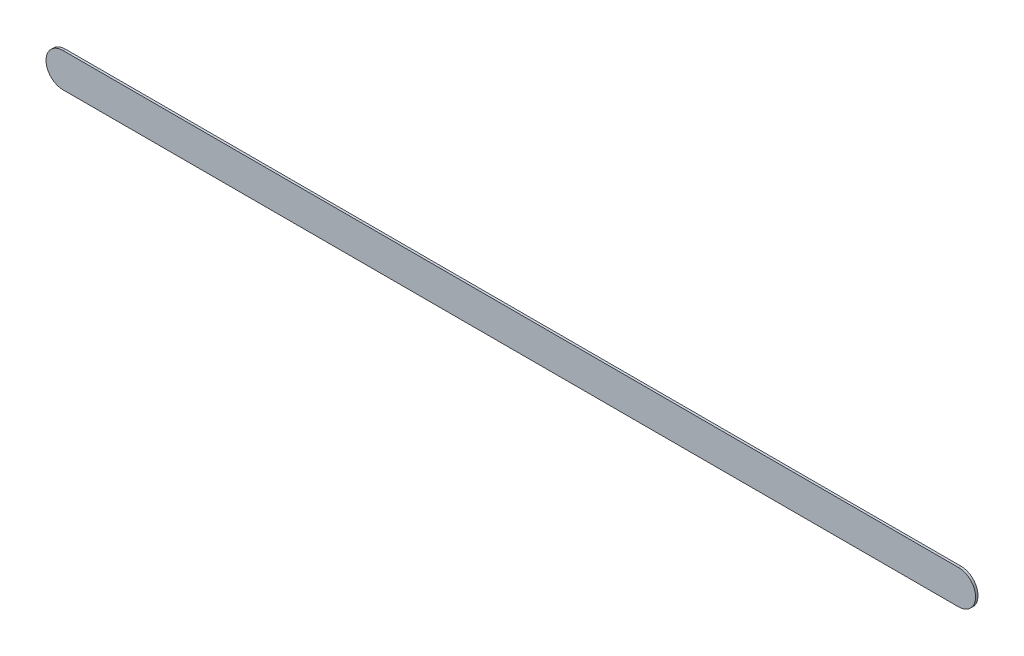
ISO-10303-21;
HEADER;
FILE_DESCRIPTION(('STEP AP214'),'2;1');
FILE_NAME('part.step','',(''),(''),'','','');
FILE_SCHEMA(('AUTOMOTIVE_DESIGN { 1 0 10303 214 1 1 1 1 }'));
ENDSEC;
DATA;
#1=APPLICATION_CONTEXT('core data for automotive mechanical design processes');
#2=APPLICATION_PROTOCOL_DEFINITION('international standard','automotive_design',2000,#1);
#3=PRODUCT_CONTEXT('',#1,'mechanical');
#4=PRODUCT('Part','Part','',(#3));
#5=PRODUCT_RELATED_PRODUCT_CATEGORY('part','',(#4));
#6=PRODUCT_DEFINITION_FORMATION('','',#4);
#7=PRODUCT_DEFINITION_CONTEXT('part definition',#1,'design');
#8=PRODUCT_DEFINITION('design','',#6,#7);
#9=PRODUCT_DEFINITION_SHAPE('','',#8);
#10=(LENGTH_UNIT() NAMED_UNIT(*) SI_UNIT(.MILLI.,.METRE.));
#11=(NAMED_UNIT(*) PLANE_ANGLE_UNIT() SI_UNIT($,.RADIAN.));
#12=(NAMED_UNIT(*) SI_UNIT($,.STERADIAN.) SOLID_ANGLE_UNIT());
#13=UNCERTAINTY_MEASURE_WITH_UNIT(LENGTH_MEASURE(1.E-05),#10,'distance_accuracy_value','');
#14=(GEOMETRIC_REPRESENTATION_CONTEXT(3) GLOBAL_UNCERTAINTY_ASSIGNED_CONTEXT((#13)) GLOBAL_UNIT_ASSIGNED_CONTEXT((#10,
#11,#12)) REPRESENTATION_CONTEXT('',''));
#15=CARTESIAN_POINT('',(0.,0.,0.));
#16=DIRECTION('',(0.,0.,1.));
#17=DIRECTION('',(1.,0.,0.));
#18=AXIS2_PLACEMENT_3D('',#15,#16,#17);
#19=CARTESIAN_POINT('',(124.8,-129.61,1.635));
#20=DIRECTION('',(0.,0.,1.));
#21=DIRECTION('',(1.,0.,0.));
#22=AXIS2_PLACEMENT_3D('',#19,#20,#21);
#23=PLANE('',#22);
#24=DIRECTION('',(-1.,0.,0.));
#25=VECTOR('',#24,1.);
#26=CARTESIAN_POINT('',(124.8,-129.61,1.635));
#27=LINE('',#26,#25);
#28=CARTESIAN_POINT('',(124.8,-129.61,1.635));
#29=VERTEX_POINT('',#28);
#30=CARTESIAN_POINT('',(111.66,-129.61,1.635));
#31=VERTEX_POINT('',#30);
#32=EDGE_CURVE('E93',#29,#31,#27,.T.);
#33=ORIENTED_EDGE('',*,*,#32,.T.);
#34=CARTESIAN_POINT('',(111.66,-129.86,1.635));
#35=DIRECTION('',(0.,0.,1.));
#36=DIRECTION('',(0.,1.,0.));
#37=AXIS2_PLACEMENT_3D('',#34,#35,#36);
#38=CIRCLE('',#37,0.25);
#39=CARTESIAN_POINT('',(111.66,-130.11,1.635));
#40=VERTEX_POINT('',#39);
#41=EDGE_CURVE('E71',#31,#40,#38,.T.);
#42=ORIENTED_EDGE('',*,*,#41,.T.);
#43=DIRECTION('',(1.,0.,0.));
#44=VECTOR('',#43,1.);
#45=CARTESIAN_POINT('',(111.66,-130.11,1.635));
#46=LINE('',#45,#44);
#47=CARTESIAN_POINT('',(124.8,-130.11,1.635));
#48=VERTEX_POINT('',#47);
#49=EDGE_CURVE('E86',#40,#48,#46,.T.);
#50=ORIENTED_EDGE('',*,*,#49,.T.);
#51=CARTESIAN_POINT('',(124.8,-129.86,1.635));
#52=DIRECTION('',(0.,0.,1.));
#53=DIRECTION('',(0.,-1.,0.));
#54=AXIS2_PLACEMENT_3D('',#51,#52,#53);
#55=CIRCLE('',#54,0.25);
#56=EDGE_CURVE('E11',#48,#29,#55,.T.);
#57=ORIENTED_EDGE('',*,*,#56,.T.);
#58=EDGE_LOOP('',(#33,#42,#50,#57));
#59=FACE_BOUND('',#58,.T.);
#60=ADVANCED_FACE('F17',(#59),#23,.T.);
#61=CARTESIAN_POINT('',(124.8,-129.61,1.6));
#62=DIRECTION('',(0.,0.,1.));
#63=DIRECTION('',(1.,0.,0.));
#64=AXIS2_PLACEMENT_3D('',#61,#62,#63);
#65=PLANE('',#64);
#66=CARTESIAN_POINT('',(124.8,-129.86,1.6));
#67=DIRECTION('',(0.,0.,1.));
#68=DIRECTION('',(0.,-1.,0.));
#69=AXIS2_PLACEMENT_3D('',#66,#67,#68);
#70=CIRCLE('',#69,0.25);
#71=CARTESIAN_POINT('',(124.8,-130.11,1.6));
#72=VERTEX_POINT('',#71);
#73=CARTESIAN_POINT('',(124.8,-129.61,1.6));
#74=VERTEX_POINT('',#73);
#75=EDGE_CURVE('E25',#72,#74,#70,.T.);
#76=ORIENTED_EDGE('',*,*,#75,.F.);
#77=DIRECTION('',(1.,0.,0.));
#78=VECTOR('',#77,1.);
#79=CARTESIAN_POINT('',(111.66,-130.11,1.6));
#80=LINE('',#79,#78);
#81=CARTESIAN_POINT('',(111.66,-130.11,1.6));
#82=VERTEX_POINT('',#81);
#83=EDGE_CURVE('E57',#82,#72,#80,.T.);
#84=ORIENTED_EDGE('',*,*,#83,.F.);
#85=CARTESIAN_POINT('',(111.66,-129.86,1.6));
#86=DIRECTION('',(0.,0.,1.));
#87=DIRECTION('',(0.,1.,0.));
#88=AXIS2_PLACEMENT_3D('',#85,#86,#87);
#89=CIRCLE('',#88,0.25);
#90=CARTESIAN_POINT('',(111.66,-129.61,1.6));
#91=VERTEX_POINT('',#90);
#92=EDGE_CURVE('E95',#91,#82,#89,.T.);
#93=ORIENTED_EDGE('',*,*,#92,.F.);
#94=DIRECTION('',(-1.,0.,0.));
#95=VECTOR('',#94,1.);
#96=CARTESIAN_POINT('',(124.8,-129.61,1.6));
#97=LINE('',#96,#95);
#98=EDGE_CURVE('E92',#74,#91,#97,.T.);
#99=ORIENTED_EDGE('',*,*,#98,.F.);
#100=EDGE_LOOP('',(#76,#84,#93,#99));
#101=FACE_BOUND('',#100,.T.);
#102=ADVANCED_FACE('F97',(#101),#65,.F.);
#103=CARTESIAN_POINT('',(124.8,-129.86,1.6));
#104=DIRECTION('',(0.,0.,-1.));
#105=DIRECTION('',(0.,-1.,0.));
#106=AXIS2_PLACEMENT_3D('',#103,#104,#105);
#107=CYLINDRICAL_SURFACE('',#106,0.25);
#108=ORIENTED_EDGE('',*,*,#75,.T.);
#109=DIRECTION('',(0.,0.,1.));
#110=VECTOR('',#109,1.);
#111=CARTESIAN_POINT('',(124.8,-129.61,1.6));
#112=LINE('',#111,#110);
#113=EDGE_CURVE('E81',#74,#29,#112,.T.);
#114=ORIENTED_EDGE('',*,*,#113,.T.);
#115=ORIENTED_EDGE('',*,*,#56,.F.);
#116=DIRECTION('',(0.,0.,1.));
#117=VECTOR('',#116,1.);
#118=CARTESIAN_POINT('',(124.8,-130.11,1.6));
#119=LINE('',#118,#117);
#120=EDGE_CURVE('E84',#72,#48,#119,.T.);
#121=ORIENTED_EDGE('',*,*,#120,.F.);
#122=EDGE_LOOP('',(#108,#114,#115,#121));
#123=FACE_BOUND('',#122,.T.);
#124=ADVANCED_FACE('F80',(#123),#107,.T.);
#125=CARTESIAN_POINT('',(111.66,-130.11,1.6));
#126=DIRECTION('',(0.,1.,0.));
#127=DIRECTION('',(1.,0.,0.));
#128=AXIS2_PLACEMENT_3D('',#125,#126,#127);
#129=PLANE('',#128);
#130=ORIENTED_EDGE('',*,*,#83,.T.);
#131=ORIENTED_EDGE('',*,*,#120,.T.);
#132=ORIENTED_EDGE('',*,*,#49,.F.);
#133=DIRECTION('',(0.,0.,1.));
#134=VECTOR('',#133,1.);
#135=CARTESIAN_POINT('',(111.66,-130.11,1.6));
#136=LINE('',#135,#134);
#137=EDGE_CURVE('E110',#82,#40,#136,.T.);
#138=ORIENTED_EDGE('',*,*,#137,.F.);
#139=EDGE_LOOP('',(#130,#131,#132,#138));
#140=FACE_BOUND('',#139,.T.);
#141=ADVANCED_FACE('F126',(#140),#129,.F.);
#142=CARTESIAN_POINT('',(111.66,-129.86,1.6));
#143=DIRECTION('',(0.,0.,-1.));
#144=DIRECTION('',(0.,1.,0.));
#145=AXIS2_PLACEMENT_3D('',#142,#143,#144);
#146=CYLINDRICAL_SURFACE('',#145,0.25);
#147=ORIENTED_EDGE('',*,*,#92,.T.);
#148=ORIENTED_EDGE('',*,*,#137,.T.);
#149=ORIENTED_EDGE('',*,*,#41,.F.);
#150=DIRECTION('',(0.,0.,1.));
#151=VECTOR('',#150,1.);
#152=CARTESIAN_POINT('',(111.66,-129.61,1.6));
#153=LINE('',#152,#151);
#154=EDGE_CURVE('E100',#91,#31,#153,.T.);
#155=ORIENTED_EDGE('',*,*,#154,.F.);
#156=EDGE_LOOP('',(#147,#148,#149,#155));
#157=FACE_BOUND('',#156,.T.);
#158=ADVANCED_FACE('F127',(#157),#146,.T.);
#159=CARTESIAN_POINT('',(124.8,-129.61,1.6));
#160=DIRECTION('',(0.,-1.,0.));
#161=DIRECTION('',(0.,0.,-1.));
#162=AXIS2_PLACEMENT_3D('',#159,#160,#161);
#163=PLANE('',#162);
#164=ORIENTED_EDGE('',*,*,#98,.T.);
#165=ORIENTED_EDGE('',*,*,#154,.T.);
#166=ORIENTED_EDGE('',*,*,#32,.F.);
#167=ORIENTED_EDGE('',*,*,#113,.F.);
#168=EDGE_LOOP('',(#164,#165,#166,#167));
#169=FACE_BOUND('',#168,.T.);
#170=ADVANCED_FACE('F90',(#169),#163,.F.);
#171=CLOSED_SHELL('',(#60,#102,#124,#141,#158,#170));
#172=MANIFOLD_SOLID_BREP('B1',#171);
#173=ADVANCED_BREP_SHAPE_REPRESENTATION('',(#18,#172),#14);
#174=SHAPE_DEFINITION_REPRESENTATION(#9,#173);
ENDSEC;
END-ISO-10303-21;
